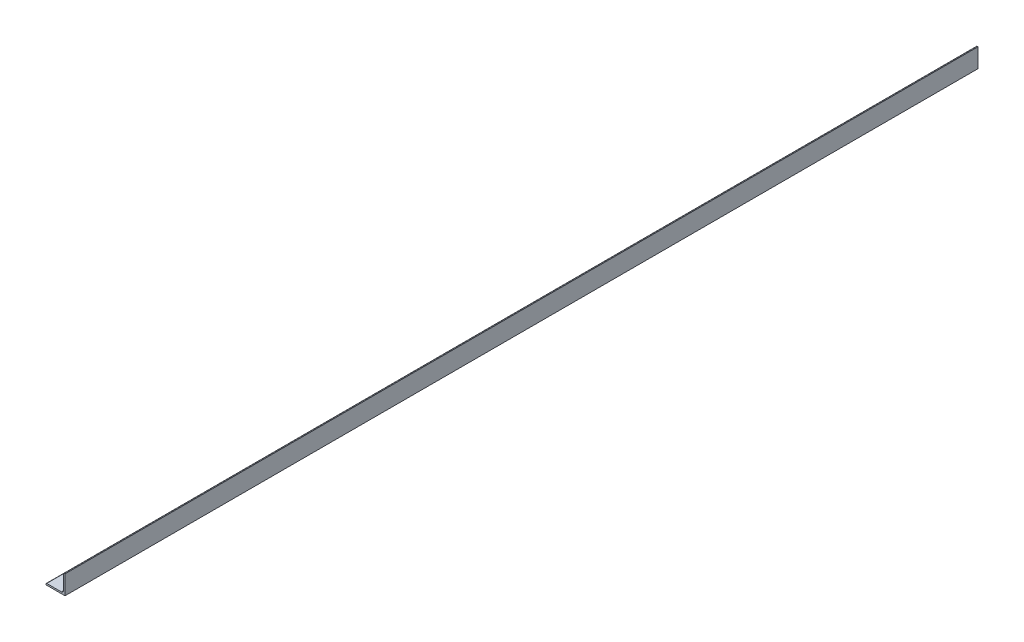
ISO-10303-21;
HEADER;
FILE_DESCRIPTION(('STEP AP214'),'2;1');
FILE_NAME('part.step','',(''),(''),'','','');
FILE_SCHEMA(('AUTOMOTIVE_DESIGN { 1 0 10303 214 1 1 1 1 }'));
ENDSEC;
DATA;
#1=APPLICATION_CONTEXT('core data for automotive mechanical design processes');
#2=APPLICATION_PROTOCOL_DEFINITION('international standard','automotive_design',2000,#1);
#3=PRODUCT_CONTEXT('',#1,'mechanical');
#4=PRODUCT('Part','Part','',(#3));
#5=PRODUCT_RELATED_PRODUCT_CATEGORY('part','',(#4));
#6=PRODUCT_DEFINITION_FORMATION('','',#4);
#7=PRODUCT_DEFINITION_CONTEXT('part definition',#1,'design');
#8=PRODUCT_DEFINITION('design','',#6,#7);
#9=PRODUCT_DEFINITION_SHAPE('','',#8);
#10=(LENGTH_UNIT() NAMED_UNIT(*) SI_UNIT(.MILLI.,.METRE.));
#11=(NAMED_UNIT(*) PLANE_ANGLE_UNIT() SI_UNIT($,.RADIAN.));
#12=(NAMED_UNIT(*) SI_UNIT($,.STERADIAN.) SOLID_ANGLE_UNIT());
#13=UNCERTAINTY_MEASURE_WITH_UNIT(LENGTH_MEASURE(1.E-05),#10,'distance_accuracy_value','');
#14=(GEOMETRIC_REPRESENTATION_CONTEXT(3) GLOBAL_UNCERTAINTY_ASSIGNED_CONTEXT((#13)) GLOBAL_UNIT_ASSIGNED_CONTEXT((#10,
#11,#12)) REPRESENTATION_CONTEXT('',''));
#15=CARTESIAN_POINT('',(0.,0.,0.));
#16=DIRECTION('',(0.,0.,1.));
#17=DIRECTION('',(1.,0.,0.));
#18=AXIS2_PLACEMENT_3D('',#15,#16,#17);
#19=CARTESIAN_POINT('',(-9.525,-8.73125000000001,457.2));
#20=DIRECTION('',(1.,0.,0.));
#21=DIRECTION('',(0.,0.,-1.));
#22=AXIS2_PLACEMENT_3D('',#19,#20,#21);
#23=PLANE('',#22);
#24=DIRECTION('',(0.,-1.,0.));
#25=VECTOR('',#24,1.);
#26=CARTESIAN_POINT('',(-9.525,-8.73125000000001,-457.2));
#27=LINE('',#26,#25);
#28=CARTESIAN_POINT('',(-9.525,-8.73125000000001,-457.2));
#29=VERTEX_POINT('',#28);
#30=CARTESIAN_POINT('',(-9.525,-9.525,-457.2));
#31=VERTEX_POINT('',#30);
#32=EDGE_CURVE('E150',#29,#31,#27,.T.);
#33=ORIENTED_EDGE('',*,*,#32,.T.);
#34=DIRECTION('',(0.,0.,-1.));
#35=VECTOR('',#34,1.);
#36=CARTESIAN_POINT('',(-9.525,-9.525,457.2));
#37=LINE('',#36,#35);
#38=CARTESIAN_POINT('',(-9.525,-9.525,457.2));
#39=VERTEX_POINT('',#38);
#40=EDGE_CURVE('E11',#39,#31,#37,.T.);
#41=ORIENTED_EDGE('',*,*,#40,.F.);
#42=DIRECTION('',(0.,-1.,0.));
#43=VECTOR('',#42,1.);
#44=CARTESIAN_POINT('',(-9.525,-8.73125000000001,457.2));
#45=LINE('',#44,#43);
#46=CARTESIAN_POINT('',(-9.525,-8.73125000000001,457.2));
#47=VERTEX_POINT('',#46);
#48=EDGE_CURVE('E175',#47,#39,#45,.T.);
#49=ORIENTED_EDGE('',*,*,#48,.F.);
#50=DIRECTION('',(0.,0.,-1.));
#51=VECTOR('',#50,1.);
#52=CARTESIAN_POINT('',(-9.525,-8.73125000000001,457.2));
#53=LINE('',#52,#51);
#54=EDGE_CURVE('E146',#47,#29,#53,.T.);
#55=ORIENTED_EDGE('',*,*,#54,.T.);
#56=EDGE_LOOP('',(#33,#41,#49,#55));
#57=FACE_BOUND('',#56,.T.);
#58=ADVANCED_FACE('F43',(#57),#23,.F.);
#59=CARTESIAN_POINT('',(-9.525,-9.525,457.2));
#60=DIRECTION('',(0.,1.,0.));
#61=DIRECTION('',(-1.,0.,0.));
#62=AXIS2_PLACEMENT_3D('',#59,#60,#61);
#63=PLANE('',#62);
#64=DIRECTION('',(1.,0.,0.));
#65=VECTOR('',#64,1.);
#66=CARTESIAN_POINT('',(-9.525,-9.525,-457.2));
#67=LINE('',#66,#65);
#68=CARTESIAN_POINT('',(9.525,-9.525,-457.2));
#69=VERTEX_POINT('',#68);
#70=EDGE_CURVE('E154',#31,#69,#67,.T.);
#71=ORIENTED_EDGE('',*,*,#70,.T.);
#72=DIRECTION('',(0.,0.,-1.));
#73=VECTOR('',#72,1.);
#74=CARTESIAN_POINT('',(9.525,-9.525,457.2));
#75=LINE('',#74,#73);
#76=CARTESIAN_POINT('',(9.525,-9.525,457.2));
#77=VERTEX_POINT('',#76);
#78=EDGE_CURVE('E52',#77,#69,#75,.T.);
#79=ORIENTED_EDGE('',*,*,#78,.F.);
#80=DIRECTION('',(1.,0.,0.));
#81=VECTOR('',#80,1.);
#82=CARTESIAN_POINT('',(-9.525,-9.525,457.2));
#83=LINE('',#82,#81);
#84=EDGE_CURVE('E106',#39,#77,#83,.T.);
#85=ORIENTED_EDGE('',*,*,#84,.F.);
#86=ORIENTED_EDGE('',*,*,#40,.T.);
#87=EDGE_LOOP('',(#71,#79,#85,#86));
#88=FACE_BOUND('',#87,.T.);
#89=ADVANCED_FACE('F231',(#88),#63,.F.);
#90=CARTESIAN_POINT('',(9.525,-9.525,457.2));
#91=DIRECTION('',(-1.,0.,0.));
#92=DIRECTION('',(0.,-1.,0.));
#93=AXIS2_PLACEMENT_3D('',#90,#91,#92);
#94=PLANE('',#93);
#95=DIRECTION('',(0.,1.,0.));
#96=VECTOR('',#95,1.);
#97=CARTESIAN_POINT('',(9.525,-9.525,-457.2));
#98=LINE('',#97,#96);
#99=CARTESIAN_POINT('',(9.525,9.525,-457.2));
#100=VERTEX_POINT('',#99);
#101=EDGE_CURVE('E157',#69,#100,#98,.T.);
#102=ORIENTED_EDGE('',*,*,#101,.T.);
#103=DIRECTION('',(0.,0.,-1.));
#104=VECTOR('',#103,1.);
#105=CARTESIAN_POINT('',(9.525,9.525,457.2));
#106=LINE('',#105,#104);
#107=CARTESIAN_POINT('',(9.525,9.525,457.2));
#108=VERTEX_POINT('',#107);
#109=EDGE_CURVE('E190',#108,#100,#106,.T.);
#110=ORIENTED_EDGE('',*,*,#109,.F.);
#111=DIRECTION('',(0.,1.,0.));
#112=VECTOR('',#111,1.);
#113=CARTESIAN_POINT('',(9.525,-9.525,457.2));
#114=LINE('',#113,#112);
#115=EDGE_CURVE('E200',#77,#108,#114,.T.);
#116=ORIENTED_EDGE('',*,*,#115,.F.);
#117=ORIENTED_EDGE('',*,*,#78,.T.);
#118=EDGE_LOOP('',(#102,#110,#116,#117));
#119=FACE_BOUND('',#118,.T.);
#120=ADVANCED_FACE('F198',(#119),#94,.F.);
#121=CARTESIAN_POINT('',(8.73125000000001,9.525,457.2));
#122=DIRECTION('',(0.,-1.,0.));
#123=DIRECTION('',(1.,0.,0.));
#124=AXIS2_PLACEMENT_3D('',#121,#122,#123);
#125=PLANE('',#124);
#126=DIRECTION('',(-1.,0.,0.));
#127=VECTOR('',#126,1.);
#128=CARTESIAN_POINT('',(8.73125000000001,9.525,-457.2));
#129=LINE('',#128,#127);
#130=CARTESIAN_POINT('',(8.73125000000001,9.525,-457.2));
#131=VERTEX_POINT('',#130);
#132=EDGE_CURVE('E160',#100,#131,#129,.T.);
#133=ORIENTED_EDGE('',*,*,#132,.T.);
#134=DIRECTION('',(0.,0.,-1.));
#135=VECTOR('',#134,1.);
#136=CARTESIAN_POINT('',(8.73125000000001,9.525,457.2));
#137=LINE('',#136,#135);
#138=CARTESIAN_POINT('',(8.73125000000001,9.525,457.2));
#139=VERTEX_POINT('',#138);
#140=EDGE_CURVE('E186',#139,#131,#137,.T.);
#141=ORIENTED_EDGE('',*,*,#140,.F.);
#142=DIRECTION('',(-1.,0.,0.));
#143=VECTOR('',#142,1.);
#144=CARTESIAN_POINT('',(8.73125000000001,9.525,457.2));
#145=LINE('',#144,#143);
#146=EDGE_CURVE('E217',#108,#139,#145,.T.);
#147=ORIENTED_EDGE('',*,*,#146,.F.);
#148=ORIENTED_EDGE('',*,*,#109,.T.);
#149=EDGE_LOOP('',(#133,#141,#147,#148));
#150=FACE_BOUND('',#149,.T.);
#151=ADVANCED_FACE('F209',(#150),#125,.F.);
#152=CARTESIAN_POINT('',(8.73125000000001,8.73125000000002,457.2));
#153=DIRECTION('',(0.,0.,-1.));
#154=DIRECTION('',(-1.,0.,0.));
#155=AXIS2_PLACEMENT_3D('',#152,#153,#154);
#156=CYLINDRICAL_SURFACE('',#155,0.793749999999986);
#157=CARTESIAN_POINT('',(8.73125000000001,8.73125000000002,-457.2));
#158=DIRECTION('',(0.,0.,1.));
#159=DIRECTION('',(-1.,0.,0.));
#160=AXIS2_PLACEMENT_3D('',#157,#158,#159);
#161=CIRCLE('',#160,0.793749999999986);
#162=CARTESIAN_POINT('',(7.93750000000003,8.73125000000002,-457.2));
#163=VERTEX_POINT('',#162);
#164=EDGE_CURVE('E163',#131,#163,#161,.T.);
#165=ORIENTED_EDGE('',*,*,#164,.T.);
#166=DIRECTION('',(0.,0.,-1.));
#167=VECTOR('',#166,1.);
#168=CARTESIAN_POINT('',(7.93750000000003,8.73125000000002,457.2));
#169=LINE('',#168,#167);
#170=CARTESIAN_POINT('',(7.93750000000003,8.73125000000002,457.2));
#171=VERTEX_POINT('',#170);
#172=EDGE_CURVE('E182',#171,#163,#169,.T.);
#173=ORIENTED_EDGE('',*,*,#172,.F.);
#174=CARTESIAN_POINT('',(8.73125000000001,8.73125000000002,457.2));
#175=DIRECTION('',(0.,0.,1.));
#176=DIRECTION('',(-1.,0.,0.));
#177=AXIS2_PLACEMENT_3D('',#174,#175,#176);
#178=CIRCLE('',#177,0.793749999999986);
#179=EDGE_CURVE('E215',#139,#171,#178,.T.);
#180=ORIENTED_EDGE('',*,*,#179,.F.);
#181=ORIENTED_EDGE('',*,*,#140,.T.);
#182=EDGE_LOOP('',(#165,#173,#180,#181));
#183=FACE_BOUND('',#182,.T.);
#184=ADVANCED_FACE('F213',(#183),#156,.T.);
#185=CARTESIAN_POINT('',(7.93750000000003,8.73125000000002,457.2));
#186=DIRECTION('',(1.,0.,0.));
#187=DIRECTION('',(0.,1.,0.));
#188=AXIS2_PLACEMENT_3D('',#185,#186,#187);
#189=PLANE('',#188);
#190=DIRECTION('',(0.,-1.,0.));
#191=VECTOR('',#190,1.);
#192=CARTESIAN_POINT('',(7.93750000000003,8.73125000000002,-457.2));
#193=LINE('',#192,#191);
#194=CARTESIAN_POINT('',(7.93750000000003,-5.54990000000002,-457.2));
#195=VERTEX_POINT('',#194);
#196=EDGE_CURVE('E166',#163,#195,#193,.T.);
#197=ORIENTED_EDGE('',*,*,#196,.T.);
#198=DIRECTION('',(0.,0.,-1.));
#199=VECTOR('',#198,1.);
#200=CARTESIAN_POINT('',(7.93750000000003,-5.54990000000002,457.2));
#201=LINE('',#200,#199);
#202=CARTESIAN_POINT('',(7.93750000000003,-5.54990000000002,457.2));
#203=VERTEX_POINT('',#202);
#204=EDGE_CURVE('E139',#203,#195,#201,.T.);
#205=ORIENTED_EDGE('',*,*,#204,.F.);
#206=DIRECTION('',(0.,-1.,0.));
#207=VECTOR('',#206,1.);
#208=CARTESIAN_POINT('',(7.93750000000003,8.73125000000002,457.2));
#209=LINE('',#208,#207);
#210=EDGE_CURVE('E128',#171,#203,#209,.T.);
#211=ORIENTED_EDGE('',*,*,#210,.F.);
#212=ORIENTED_EDGE('',*,*,#172,.T.);
#213=EDGE_LOOP('',(#197,#205,#211,#212));
#214=FACE_BOUND('',#213,.T.);
#215=ADVANCED_FACE('F243',(#214),#189,.F.);
#216=CARTESIAN_POINT('',(5.54990000000003,-5.54990000000002,457.2));
#217=DIRECTION('',(0.,0.,-1.));
#218=DIRECTION('',(-1.,0.,0.));
#219=AXIS2_PLACEMENT_3D('',#216,#217,#218);
#220=CYLINDRICAL_SURFACE('',#219,2.3876);
#221=CARTESIAN_POINT('',(5.54990000000003,-5.54990000000002,-457.2));
#222=DIRECTION('',(0.,0.,-1.));
#223=DIRECTION('',(-1.,0.,0.));
#224=AXIS2_PLACEMENT_3D('',#221,#222,#223);
#225=CIRCLE('',#224,2.3876);
#226=CARTESIAN_POINT('',(5.54990000000003,-7.93750000000002,-457.2));
#227=VERTEX_POINT('',#226);
#228=EDGE_CURVE('E137',#195,#227,#225,.T.);
#229=ORIENTED_EDGE('',*,*,#228,.T.);
#230=DIRECTION('',(0.,0.,-1.));
#231=VECTOR('',#230,1.);
#232=CARTESIAN_POINT('',(5.54990000000003,-7.93750000000002,457.2));
#233=LINE('',#232,#231);
#234=CARTESIAN_POINT('',(5.54990000000003,-7.93750000000002,457.2));
#235=VERTEX_POINT('',#234);
#236=EDGE_CURVE('E134',#235,#227,#233,.T.);
#237=ORIENTED_EDGE('',*,*,#236,.F.);
#238=CARTESIAN_POINT('',(5.54990000000003,-5.54990000000002,457.2));
#239=DIRECTION('',(0.,0.,-1.));
#240=DIRECTION('',(-1.,0.,0.));
#241=AXIS2_PLACEMENT_3D('',#238,#239,#240);
#242=CIRCLE('',#241,2.3876);
#243=EDGE_CURVE('E122',#203,#235,#242,.T.);
#244=ORIENTED_EDGE('',*,*,#243,.F.);
#245=ORIENTED_EDGE('',*,*,#204,.T.);
#246=EDGE_LOOP('',(#229,#237,#244,#245));
#247=FACE_BOUND('',#246,.T.);
#248=ADVANCED_FACE('F135',(#247),#220,.F.);
#249=CARTESIAN_POINT('',(5.54990000000003,-7.93750000000002,457.2));
#250=DIRECTION('',(0.,-1.,0.));
#251=DIRECTION('',(1.,0.,0.));
#252=AXIS2_PLACEMENT_3D('',#249,#250,#251);
#253=PLANE('',#252);
#254=DIRECTION('',(-1.,0.,0.));
#255=VECTOR('',#254,1.);
#256=CARTESIAN_POINT('',(5.54990000000003,-7.93750000000002,-457.2));
#257=LINE('',#256,#255);
#258=CARTESIAN_POINT('',(-8.73125000000001,-7.93750000000003,-457.2));
#259=VERTEX_POINT('',#258);
#260=EDGE_CURVE('E92',#227,#259,#257,.T.);
#261=ORIENTED_EDGE('',*,*,#260,.T.);
#262=DIRECTION('',(0.,0.,-1.));
#263=VECTOR('',#262,1.);
#264=CARTESIAN_POINT('',(-8.73125000000001,-7.93750000000003,457.2));
#265=LINE('',#264,#263);
#266=CARTESIAN_POINT('',(-8.73125000000001,-7.93750000000003,457.2));
#267=VERTEX_POINT('',#266);
#268=EDGE_CURVE('E140',#267,#259,#265,.T.);
#269=ORIENTED_EDGE('',*,*,#268,.F.);
#270=DIRECTION('',(-1.,0.,0.));
#271=VECTOR('',#270,1.);
#272=CARTESIAN_POINT('',(5.54990000000003,-7.93750000000002,457.2));
#273=LINE('',#272,#271);
#274=EDGE_CURVE('E126',#235,#267,#273,.T.);
#275=ORIENTED_EDGE('',*,*,#274,.F.);
#276=ORIENTED_EDGE('',*,*,#236,.T.);
#277=EDGE_LOOP('',(#261,#269,#275,#276));
#278=FACE_BOUND('',#277,.T.);
#279=ADVANCED_FACE('F142',(#278),#253,.F.);
#280=CARTESIAN_POINT('',(-8.73125000000001,-8.73125000000001,457.2));
#281=DIRECTION('',(0.,0.,-1.));
#282=DIRECTION('',(-1.,0.,0.));
#283=AXIS2_PLACEMENT_3D('',#280,#281,#282);
#284=CYLINDRICAL_SURFACE('',#283,0.793749999999986);
#285=CARTESIAN_POINT('',(-8.73125000000001,-8.73125000000001,-457.2));
#286=DIRECTION('',(0.,0.,1.));
#287=DIRECTION('',(-1.,0.,0.));
#288=AXIS2_PLACEMENT_3D('',#285,#286,#287);
#289=CIRCLE('',#288,0.793749999999986);
#290=EDGE_CURVE('E98',#259,#29,#289,.T.);
#291=ORIENTED_EDGE('',*,*,#290,.T.);
#292=ORIENTED_EDGE('',*,*,#54,.F.);
#293=CARTESIAN_POINT('',(-8.73125000000001,-8.73125000000001,457.2));
#294=DIRECTION('',(0.,0.,1.));
#295=DIRECTION('',(-1.,0.,0.));
#296=AXIS2_PLACEMENT_3D('',#293,#294,#295);
#297=CIRCLE('',#296,0.793749999999986);
#298=EDGE_CURVE('E60',#267,#47,#297,.T.);
#299=ORIENTED_EDGE('',*,*,#298,.F.);
#300=ORIENTED_EDGE('',*,*,#268,.T.);
#301=EDGE_LOOP('',(#291,#292,#299,#300));
#302=FACE_BOUND('',#301,.T.);
#303=ADVANCED_FACE('F251',(#302),#284,.T.);
#304=CARTESIAN_POINT('',(8.73125000000001,8.73125000000002,457.2));
#305=DIRECTION('',(0.,0.,-1.));
#306=DIRECTION('',(-1.,0.,0.));
#307=AXIS2_PLACEMENT_3D('',#304,#305,#306);
#308=PLANE('',#307);
#309=ORIENTED_EDGE('',*,*,#48,.T.);
#310=ORIENTED_EDGE('',*,*,#84,.T.);
#311=ORIENTED_EDGE('',*,*,#115,.T.);
#312=ORIENTED_EDGE('',*,*,#146,.T.);
#313=ORIENTED_EDGE('',*,*,#179,.T.);
#314=ORIENTED_EDGE('',*,*,#210,.T.);
#315=ORIENTED_EDGE('',*,*,#243,.T.);
#316=ORIENTED_EDGE('',*,*,#274,.T.);
#317=ORIENTED_EDGE('',*,*,#298,.T.);
#318=EDGE_LOOP('',(#309,#310,#311,#312,#313,#314,#315,#316,#317));
#319=FACE_BOUND('',#318,.T.);
#320=ADVANCED_FACE('F124',(#319),#308,.F.);
#321=CARTESIAN_POINT('',(8.73125000000001,8.73125000000002,-457.2));
#322=DIRECTION('',(0.,0.,-1.));
#323=DIRECTION('',(-1.,0.,0.));
#324=AXIS2_PLACEMENT_3D('',#321,#322,#323);
#325=PLANE('',#324);
#326=ORIENTED_EDGE('',*,*,#32,.F.);
#327=ORIENTED_EDGE('',*,*,#290,.F.);
#328=ORIENTED_EDGE('',*,*,#260,.F.);
#329=ORIENTED_EDGE('',*,*,#228,.F.);
#330=ORIENTED_EDGE('',*,*,#196,.F.);
#331=ORIENTED_EDGE('',*,*,#164,.F.);
#332=ORIENTED_EDGE('',*,*,#132,.F.);
#333=ORIENTED_EDGE('',*,*,#101,.F.);
#334=ORIENTED_EDGE('',*,*,#70,.F.);
#335=EDGE_LOOP('',(#326,#327,#328,#329,#330,#331,#332,#333,#334));
#336=FACE_BOUND('',#335,.T.);
#337=ADVANCED_FACE('F204',(#336),#325,.T.);
#338=CLOSED_SHELL('',(#58,#89,#120,#151,#184,#215,#248,#279,#303,#320,#337));
#339=MANIFOLD_SOLID_BREP('B2',#338);
#340=ADVANCED_BREP_SHAPE_REPRESENTATION('',(#18,#339),#14);
#341=SHAPE_DEFINITION_REPRESENTATION(#9,#340);
ENDSEC;
END-ISO-10303-21;
